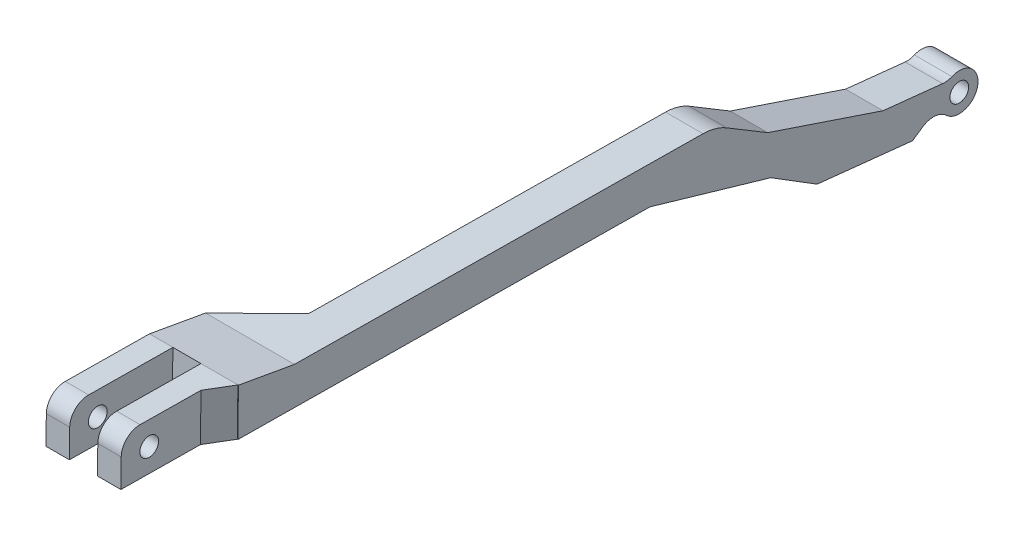
ISO-10303-21;
HEADER;
FILE_DESCRIPTION(('STEP AP214'),'2;1');
FILE_NAME('part.step','',(''),(''),'','','');
FILE_SCHEMA(('AUTOMOTIVE_DESIGN { 1 0 10303 214 1 1 1 1 }'));
ENDSEC;
DATA;
#1=APPLICATION_CONTEXT('core data for automotive mechanical design processes');
#2=APPLICATION_PROTOCOL_DEFINITION('international standard','automotive_design',2000,#1);
#3=PRODUCT_CONTEXT('',#1,'mechanical');
#4=PRODUCT('Part','Part','',(#3));
#5=PRODUCT_RELATED_PRODUCT_CATEGORY('part','',(#4));
#6=PRODUCT_DEFINITION_FORMATION('','',#4);
#7=PRODUCT_DEFINITION_CONTEXT('part definition',#1,'design');
#8=PRODUCT_DEFINITION('design','',#6,#7);
#9=PRODUCT_DEFINITION_SHAPE('','',#8);
#10=(LENGTH_UNIT() NAMED_UNIT(*) SI_UNIT(.MILLI.,.METRE.));
#11=(NAMED_UNIT(*) PLANE_ANGLE_UNIT() SI_UNIT($,.RADIAN.));
#12=(NAMED_UNIT(*) SI_UNIT($,.STERADIAN.) SOLID_ANGLE_UNIT());
#13=UNCERTAINTY_MEASURE_WITH_UNIT(LENGTH_MEASURE(1.E-05),#10,'distance_accuracy_value','');
#14=(GEOMETRIC_REPRESENTATION_CONTEXT(3) GLOBAL_UNCERTAINTY_ASSIGNED_CONTEXT((#13)) GLOBAL_UNIT_ASSIGNED_CONTEXT((#10,
#11,#12)) REPRESENTATION_CONTEXT('',''));
#15=CARTESIAN_POINT('',(0.,0.,0.));
#16=DIRECTION('',(0.,0.,1.));
#17=DIRECTION('',(1.,0.,0.));
#18=AXIS2_PLACEMENT_3D('',#15,#16,#17);
#19=CARTESIAN_POINT('',(-2.,8.74244408116195,35.8710446183788));
#20=DIRECTION('',(0.,0.960167582099717,-0.279424791822029));
#21=DIRECTION('',(1.,0.,0.));
#22=AXIS2_PLACEMENT_3D('',#19,#20,#21);
#23=PLANE('',#22);
#24=DIRECTION('',(1.,0.,0.));
#25=VECTOR('',#24,1.);
#26=CARTESIAN_POINT('',(-2.,8.74244408116195,35.8710446183788));
#27=LINE('',#26,#25);
#28=CARTESIAN_POINT('',(-2.,8.74244408116195,35.8710446183788));
#29=VERTEX_POINT('',#28);
#30=CARTESIAN_POINT('',(2.,8.74244408116195,35.8710446183788));
#31=VERTEX_POINT('',#30);
#32=EDGE_CURVE('E432',#29,#31,#27,.T.);
#33=ORIENTED_EDGE('',*,*,#32,.F.);
#34=DIRECTION('',(0.,0.279424791822029,0.960167582099717));
#35=VECTOR('',#34,1.);
#36=CARTESIAN_POINT('',(-2.,-1.56415886793033,0.455196336760537));
#37=LINE('',#36,#35);
#38=CARTESIAN_POINT('',(-2.,4.98714456433867,22.9669753923918));
#39=VERTEX_POINT('',#38);
#40=EDGE_CURVE('E51',#29,#39,#37,.F.);
#41=ORIENTED_EDGE('',*,*,#40,.T.);
#42=DIRECTION('',(-1.,0.,0.));
#43=VECTOR('',#42,1.);
#44=CARTESIAN_POINT('',(-2.,4.98714456433864,22.9669753923918));
#45=LINE('',#44,#43);
#46=CARTESIAN_POINT('',(2.,4.98714456433867,22.9669753923918));
#47=VERTEX_POINT('',#46);
#48=EDGE_CURVE('E435',#47,#39,#45,.T.);
#49=ORIENTED_EDGE('',*,*,#48,.F.);
#50=DIRECTION('',(0.,-0.279424791822029,-0.960167582099717));
#51=VECTOR('',#50,1.);
#52=CARTESIAN_POINT('',(2.,8.74244408116195,35.8710446183788));
#53=LINE('',#52,#51);
#54=EDGE_CURVE('E12',#47,#31,#53,.F.);
#55=ORIENTED_EDGE('',*,*,#54,.T.);
#56=EDGE_LOOP('',(#33,#41,#49,#55));
#57=FACE_BOUND('',#56,.T.);
#58=ADVANCED_FACE('F43',(#57),#23,.F.);
#59=CARTESIAN_POINT('',(-2.,5.18956645271218,10.9745077659779));
#60=DIRECTION('',(0.,-0.948132723625125,0.317874721220801));
#61=DIRECTION('',(1.,0.,0.));
#62=AXIS2_PLACEMENT_3D('',#59,#60,#61);
#63=PLANE('',#62);
#64=DIRECTION('',(1.,0.,0.));
#65=VECTOR('',#64,1.);
#66=CARTESIAN_POINT('',(-2.,5.18956645271218,10.974507765978));
#67=LINE('',#66,#65);
#68=CARTESIAN_POINT('',(-2.,5.18956645271218,10.9745077659779));
#69=VERTEX_POINT('',#68);
#70=CARTESIAN_POINT('',(2.,5.18956645271218,10.9745077659779));
#71=VERTEX_POINT('',#70);
#72=EDGE_CURVE('E422',#69,#71,#67,.T.);
#73=ORIENTED_EDGE('',*,*,#72,.F.);
#74=DIRECTION('',(0.,-0.317874721220801,-0.948132723625125));
#75=VECTOR('',#74,1.);
#76=CARTESIAN_POINT('',(-2.,1.35761150550606,-0.455158194718652));
#77=LINE('',#76,#75);
#78=CARTESIAN_POINT('',(-2.,9.31760736921488,23.2873166057881));
#79=VERTEX_POINT('',#78);
#80=EDGE_CURVE('E428',#69,#79,#77,.F.);
#81=ORIENTED_EDGE('',*,*,#80,.T.);
#82=DIRECTION('',(-1.,0.,0.));
#83=VECTOR('',#82,1.);
#84=CARTESIAN_POINT('',(-2.,9.31760736921488,23.2873166057881));
#85=LINE('',#84,#83);
#86=CARTESIAN_POINT('',(2.,9.31760736921488,23.2873166057881));
#87=VERTEX_POINT('',#86);
#88=EDGE_CURVE('E425',#87,#79,#85,.T.);
#89=ORIENTED_EDGE('',*,*,#88,.F.);
#90=DIRECTION('',(0.,0.317874721220801,0.948132723625125));
#91=VECTOR('',#90,1.);
#92=CARTESIAN_POINT('',(2.,5.18956645271218,10.9745077659779));
#93=LINE('',#92,#91);
#94=EDGE_CURVE('E430',#87,#71,#93,.F.);
#95=ORIENTED_EDGE('',*,*,#94,.T.);
#96=EDGE_LOOP('',(#73,#81,#89,#95));
#97=FACE_BOUND('',#96,.T.);
#98=ADVANCED_FACE('F475',(#97),#63,.F.);
#99=CARTESIAN_POINT('',(-2.,0.,0.));
#100=DIRECTION('',(1.,0.,0.));
#101=DIRECTION('',(0.,0.,-1.));
#102=AXIS2_PLACEMENT_3D('',#99,#100,#101);
#103=PLANE('',#102);
#104=ORIENTED_EDGE('',*,*,#40,.F.);
#105=DIRECTION('',(0.,0.0110604080364561,0.99993883181626));
#106=VECTOR('',#105,1.);
#107=CARTESIAN_POINT('',(-2.,8.34465047322567,-0.0923008850329777));
#108=LINE('',#107,#106);
#109=CARTESIAN_POINT('',(-2.,9.10216799989494,68.3926219316773));
#110=VERTEX_POINT('',#109);
#111=EDGE_CURVE('E337',#29,#110,#108,.T.);
#112=ORIENTED_EDGE('',*,*,#111,.T.);
#113=DIRECTION('',(0.,0.99993883181626,-0.011060408036466));
#114=VECTOR('',#113,1.);
#115=CARTESIAN_POINT('',(-2.,13.1019233271599,68.3483802995314));
#116=LINE('',#115,#114);
#117=CARTESIAN_POINT('',(-2.,13.10192332716,68.3483802995314));
#118=VERTEX_POINT('',#117);
#119=EDGE_CURVE('E362',#110,#118,#116,.T.);
#120=ORIENTED_EDGE('',*,*,#119,.T.);
#121=DIRECTION('',(0.,-0.0110604080364563,-0.99993883181626));
#122=VECTOR('',#121,1.);
#123=CARTESIAN_POINT('',(-2.,12.3444058004907,-0.136542517178804));
#124=LINE('',#123,#122);
#125=CARTESIAN_POINT('',(-2.,12.6800628135767,30.2092169204379));
#126=VERTEX_POINT('',#125);
#127=EDGE_CURVE('E333',#118,#126,#124,.T.);
#128=ORIENTED_EDGE('',*,*,#127,.T.);
#129=CARTESIAN_POINT('',(-2.,7.68036865449542,30.2645189606202));
#130=DIRECTION('',(1.,0.,0.));
#131=DIRECTION('',(0.,0.,-1.));
#132=AXIS2_PLACEMENT_3D('',#129,#130,#131);
#133=CIRCLE('',#132,5.);
#134=CARTESIAN_POINT('',(-2.,11.9646562062617,27.6867524518415));
#135=VERTEX_POINT('',#134);
#136=EDGE_CURVE('E420',#126,#135,#133,.F.);
#137=ORIENTED_EDGE('',*,*,#136,.T.);
#138=DIRECTION('',(0.,-0.515553301755732,-0.856857510353246));
#139=VECTOR('',#138,1.);
#140=CARTESIAN_POINT('',(-2.,-3.44627329115737,2.07355079758396));
#141=LINE('',#140,#139);
#142=EDGE_CURVE('E330',#135,#79,#141,.T.);
#143=ORIENTED_EDGE('',*,*,#142,.T.);
#144=ORIENTED_EDGE('',*,*,#80,.F.);
#145=DIRECTION('',(0.,0.105126340428727,0.994458874236669));
#146=VECTOR('',#145,1.);
#147=CARTESIAN_POINT('',(-2.,3.98489672467589,-0.421251818958479));
#148=LINE('',#147,#146);
#149=CARTESIAN_POINT('',(-2.,4.51699740557244,4.61223685711407));
#150=VERTEX_POINT('',#149);
#151=EDGE_CURVE('E354',#150,#69,#148,.T.);
#152=ORIENTED_EDGE('',*,*,#151,.F.);
#153=CARTESIAN_POINT('',(-2.,6.50591515404578,4.40198417625661));
#154=DIRECTION('',(1.,0.,0.));
#155=DIRECTION('',(0.,0.,-1.));
#156=AXIS2_PLACEMENT_3D('',#153,#154,#155);
#157=CIRCLE('',#156,2.);
#158=CARTESIAN_POINT('',(-2.,4.66717113939598,3.61520565050141));
#159=VERTEX_POINT('',#158);
#160=EDGE_CURVE('E352',#150,#159,#157,.T.);
#161=ORIENTED_EDGE('',*,*,#160,.T.);
#162=CARTESIAN_POINT('',(-2.,2.82842712474617,2.82842712474621));
#163=DIRECTION('',(1.,0.,0.));
#164=DIRECTION('',(0.,0.,-1.));
#165=AXIS2_PLACEMENT_3D('',#162,#163,#164);
#166=CIRCLE('',#165,2.);
#167=CARTESIAN_POINT('',(-2.,1.38051311307682,4.20811731272739));
#168=VERTEX_POINT('',#167);
#169=EDGE_CURVE('E349',#168,#159,#166,.T.);
#170=ORIENTED_EDGE('',*,*,#169,.F.);
#171=CARTESIAN_POINT('',(-2.,-0.0674008985925268,5.58780750070858));
#172=DIRECTION('',(1.,0.,0.));
#173=DIRECTION('',(0.,0.,-1.));
#174=AXIS2_PLACEMENT_3D('',#171,#172,#173);
#175=CIRCLE('',#174,2.);
#176=CARTESIAN_POINT('',(-2.,1.59134630860474,6.70519628829116));
#177=VERTEX_POINT('',#176);
#178=EDGE_CURVE('E347',#168,#177,#175,.T.);
#179=ORIENTED_EDGE('',*,*,#178,.T.);
#180=DIRECTION('',(0.,0.55869439379129,-0.829373603598633));
#181=VECTOR('',#180,1.);
#182=CARTESIAN_POINT('',(-2.,4.20158693514596,2.83033250094704));
#183=LINE('',#182,#181);
#184=CARTESIAN_POINT('',(-2.,0.834699643533607,7.8284271247462));
#185=VERTEX_POINT('',#184);
#186=EDGE_CURVE('E344',#185,#177,#183,.T.);
#187=ORIENTED_EDGE('',*,*,#186,.F.);
#188=DIRECTION('',(0.,0.105126340428727,0.994458874236669));
#189=VECTOR('',#188,1.);
#190=CARTESIAN_POINT('',(-2.,0.00706122772921731,-0.000746457243570038));
#191=LINE('',#190,#189);
#192=CARTESIAN_POINT('',(-2.,1.9109094130525,18.0089998667781));
#193=VERTEX_POINT('',#192);
#194=EDGE_CURVE('E341',#185,#193,#191,.T.);
#195=ORIENTED_EDGE('',*,*,#194,.T.);
#196=DIRECTION('',(0.,-0.527223177075936,-0.849726851143328));
#197=VECTOR('',#196,1.);
#198=CARTESIAN_POINT('',(-2.,-6.6882094665678,4.14977947227237));
#199=LINE('',#198,#197);
#200=EDGE_CURVE('E339',#39,#193,#199,.T.);
#201=ORIENTED_EDGE('',*,*,#200,.F.);
#202=EDGE_LOOP('',(#104,#112,#120,#128,#137,#143,#144,#152,#161,#170,#179,#187,#195,#201));
#203=FACE_BOUND('',#202,.T.);
#204=CARTESIAN_POINT('',(-2.,2.82842712474617,2.82842712474621));
#205=DIRECTION('',(1.,0.,0.));
#206=DIRECTION('',(0.,0.,-1.));
#207=AXIS2_PLACEMENT_3D('',#204,#205,#206);
#208=CIRCLE('',#207,1.);
#209=CARTESIAN_POINT('',(-2.,2.82842712474617,1.82842712474621));
#210=VERTEX_POINT('',#209);
#211=EDGE_CURVE('E357',#210,#210,#208,.T.);
#212=ORIENTED_EDGE('',*,*,#211,.T.);
#213=EDGE_LOOP('',(#212));
#214=FACE_BOUND('',#213,.T.);
#215=ADVANCED_FACE('F441',(#203,#214),#103,.F.);
#216=CARTESIAN_POINT('',(-2.,11.8176930361465,87.8637781320032));
#217=DIRECTION('',(1.,0.,0.));
#218=DIRECTION('',(0.,0.,-1.));
#219=AXIS2_PLACEMENT_3D('',#216,#217,#218);
#220=CIRCLE('',#219,0.999999999999998);
#221=CARTESIAN_POINT('',(-2.,11.8176930361465,86.8637781320032));
#222=VERTEX_POINT('',#221);
#223=EDGE_CURVE('E271',#222,#222,#220,.T.);
#224=ORIENTED_EDGE('',*,*,#223,.T.);
#225=EDGE_LOOP('',(#224));
#226=FACE_BOUND('',#225,.T.);
#227=DIRECTION('',(0.,-0.99993883181626,0.0110604080364562));
#228=VECTOR('',#227,1.);
#229=CARTESIAN_POINT('',(-2.,1.00637670748955,90.9835465325761));
#230=LINE('',#229,#228);
#231=CARTESIAN_POINT('',(-2.,12.350843676164,90.8580644234337));
#232=VERTEX_POINT('',#231);
#233=CARTESIAN_POINT('',(-2.,9.35102718071522,90.8912456475431));
#234=VERTEX_POINT('',#233);
#235=EDGE_CURVE('E275',#232,#234,#230,.T.);
#236=ORIENTED_EDGE('',*,*,#235,.F.);
#237=CARTESIAN_POINT('',(-2.,12.3287228600911,88.8581867598012));
#238=DIRECTION('',(1.,0.,0.));
#239=DIRECTION('',(0.,0.,-1.));
#240=AXIS2_PLACEMENT_3D('',#237,#238,#239);
#241=CIRCLE('',#240,2.);
#242=CARTESIAN_POINT('',(-2.,14.3286005237236,88.8360659437283));
#243=VERTEX_POINT('',#242);
#244=EDGE_CURVE('E407',#232,#243,#241,.F.);
#245=ORIENTED_EDGE('',*,*,#244,.T.);
#246=DIRECTION('',(0.,0.011060408036456,0.99993883181626));
#247=VECTOR('',#246,1.);
#248=CARTESIAN_POINT('',(-2.,13.344344632307,-0.147602925215257));
#249=LINE('',#248,#247);
#250=CARTESIAN_POINT('',(-2.,14.2290568513955,79.836616457382));
#251=VERTEX_POINT('',#250);
#252=EDGE_CURVE('E282',#251,#243,#249,.T.);
#253=ORIENTED_EDGE('',*,*,#252,.F.);
#254=DIRECTION('',(0.,0.99993883181626,-0.0110604080364562));
#255=VECTOR('',#254,1.);
#256=CARTESIAN_POINT('',(-2.,0.884712219088531,79.9842193825972));
#257=LINE('',#256,#255);
#258=CARTESIAN_POINT('',(-2.,9.22936269231419,79.8919184975642));
#259=VERTEX_POINT('',#258);
#260=EDGE_CURVE('E259',#259,#251,#257,.T.);
#261=ORIENTED_EDGE('',*,*,#260,.F.);
#262=EDGE_CURVE('E336',#259,#234,#108,.T.);
#263=ORIENTED_EDGE('',*,*,#262,.T.);
#264=EDGE_LOOP('',(#236,#245,#253,#261,#263));
#265=FACE_BOUND('',#264,.T.);
#266=ADVANCED_FACE('F506',(#226,#265),#103,.F.);
#267=CARTESIAN_POINT('',(-2.,-3.44627329115737,2.07355079758396));
#268=DIRECTION('',(0.,-0.856857510353246,0.515553301755732));
#269=DIRECTION('',(0.,-0.515553301755732,-0.856857510353246));
#270=AXIS2_PLACEMENT_3D('',#267,#268,#269);
#271=PLANE('',#270);
#272=DIRECTION('',(0.,-0.515553301755732,-0.856857510353246));
#273=VECTOR('',#272,1.);
#274=CARTESIAN_POINT('',(2.,-3.44627329115737,2.07355079758396));
#275=LINE('',#274,#273);
#276=CARTESIAN_POINT('',(2.,11.9646562062617,27.6867524518415));
#277=VERTEX_POINT('',#276);
#278=EDGE_CURVE('E293',#277,#87,#275,.T.);
#279=ORIENTED_EDGE('',*,*,#278,.T.);
#280=ORIENTED_EDGE('',*,*,#88,.T.);
#281=ORIENTED_EDGE('',*,*,#142,.F.);
#282=DIRECTION('',(1.,0.,0.));
#283=VECTOR('',#282,1.);
#284=CARTESIAN_POINT('',(-2.,11.9646562062617,27.6867524518415));
#285=LINE('',#284,#283);
#286=EDGE_CURVE('E413',#135,#277,#285,.T.);
#287=ORIENTED_EDGE('',*,*,#286,.T.);
#288=EDGE_LOOP('',(#279,#280,#281,#287));
#289=FACE_BOUND('',#288,.T.);
#290=ADVANCED_FACE('F478',(#289),#271,.F.);
#291=CARTESIAN_POINT('',(-2.,3.98489672467589,-0.421251818958479));
#292=DIRECTION('',(0.,0.994458874236669,-0.105126340428727));
#293=DIRECTION('',(0.,0.105126340428727,0.994458874236669));
#294=AXIS2_PLACEMENT_3D('',#291,#292,#293);
#295=PLANE('',#294);
#296=ORIENTED_EDGE('',*,*,#151,.T.);
#297=ORIENTED_EDGE('',*,*,#72,.T.);
#298=DIRECTION('',(0.,0.105126340428727,0.994458874236669));
#299=VECTOR('',#298,1.);
#300=CARTESIAN_POINT('',(2.,3.98489672467589,-0.421251818958479));
#301=LINE('',#300,#299);
#302=CARTESIAN_POINT('',(2.,4.51699740557244,4.61223685711407));
#303=VERTEX_POINT('',#302);
#304=EDGE_CURVE('E324',#303,#71,#301,.T.);
#305=ORIENTED_EDGE('',*,*,#304,.F.);
#306=DIRECTION('',(1.,0.,0.));
#307=VECTOR('',#306,1.);
#308=CARTESIAN_POINT('',(-2.,4.51699740557244,4.61223685711407));
#309=LINE('',#308,#307);
#310=EDGE_CURVE('E360',#150,#303,#309,.T.);
#311=ORIENTED_EDGE('',*,*,#310,.F.);
#312=EDGE_LOOP('',(#296,#297,#305,#311));
#313=FACE_BOUND('',#312,.T.);
#314=ADVANCED_FACE('F470',(#313),#295,.T.);
#315=CARTESIAN_POINT('',(-2.,6.50591515404578,4.40198417625661));
#316=DIRECTION('',(1.,0.,0.));
#317=DIRECTION('',(0.,0.,-1.));
#318=AXIS2_PLACEMENT_3D('',#315,#316,#317);
#319=CYLINDRICAL_SURFACE('',#318,2.);
#320=ORIENTED_EDGE('',*,*,#310,.T.);
#321=CARTESIAN_POINT('',(2.,6.50591515404578,4.40198417625661));
#322=DIRECTION('',(1.,0.,0.));
#323=DIRECTION('',(0.,0.,-1.));
#324=AXIS2_PLACEMENT_3D('',#321,#322,#323);
#325=CIRCLE('',#324,2.);
#326=CARTESIAN_POINT('',(2.,4.66717113939598,3.61520565050141));
#327=VERTEX_POINT('',#326);
#328=EDGE_CURVE('E321',#303,#327,#325,.T.);
#329=ORIENTED_EDGE('',*,*,#328,.T.);
#330=DIRECTION('',(1.,0.,0.));
#331=VECTOR('',#330,1.);
#332=CARTESIAN_POINT('',(-2.,4.66717113939598,3.61520565050141));
#333=LINE('',#332,#331);
#334=EDGE_CURVE('E363',#159,#327,#333,.T.);
#335=ORIENTED_EDGE('',*,*,#334,.F.);
#336=ORIENTED_EDGE('',*,*,#160,.F.);
#337=EDGE_LOOP('',(#320,#329,#335,#336));
#338=FACE_BOUND('',#337,.T.);
#339=ADVANCED_FACE('F465',(#338),#319,.F.);
#340=CARTESIAN_POINT('',(-2.,2.82842712474617,2.82842712474621));
#341=DIRECTION('',(1.,0.,0.));
#342=DIRECTION('',(0.,0.,-1.));
#343=AXIS2_PLACEMENT_3D('',#340,#341,#342);
#344=CYLINDRICAL_SURFACE('',#343,2.);
#345=ORIENTED_EDGE('',*,*,#334,.T.);
#346=CARTESIAN_POINT('',(2.,2.82842712474617,2.82842712474621));
#347=DIRECTION('',(1.,0.,0.));
#348=DIRECTION('',(0.,0.,-1.));
#349=AXIS2_PLACEMENT_3D('',#346,#347,#348);
#350=CIRCLE('',#349,2.);
#351=CARTESIAN_POINT('',(2.,1.38051311307682,4.20811731272739));
#352=VERTEX_POINT('',#351);
#353=EDGE_CURVE('E318',#352,#327,#350,.T.);
#354=ORIENTED_EDGE('',*,*,#353,.F.);
#355=DIRECTION('',(1.,0.,0.));
#356=VECTOR('',#355,1.);
#357=CARTESIAN_POINT('',(-2.,1.38051311307682,4.20811731272739));
#358=LINE('',#357,#356);
#359=EDGE_CURVE('E365',#168,#352,#358,.T.);
#360=ORIENTED_EDGE('',*,*,#359,.F.);
#361=ORIENTED_EDGE('',*,*,#169,.T.);
#362=EDGE_LOOP('',(#345,#354,#360,#361));
#363=FACE_BOUND('',#362,.T.);
#364=ADVANCED_FACE('F461',(#363),#344,.T.);
#365=CARTESIAN_POINT('',(-2.,-0.0674008985925268,5.58780750070858));
#366=DIRECTION('',(1.,0.,0.));
#367=DIRECTION('',(0.,0.,-1.));
#368=AXIS2_PLACEMENT_3D('',#365,#366,#367);
#369=CYLINDRICAL_SURFACE('',#368,2.);
#370=ORIENTED_EDGE('',*,*,#359,.T.);
#371=CARTESIAN_POINT('',(2.,-0.0674008985925268,5.58780750070858));
#372=DIRECTION('',(1.,0.,0.));
#373=DIRECTION('',(0.,0.,-1.));
#374=AXIS2_PLACEMENT_3D('',#371,#372,#373);
#375=CIRCLE('',#374,2.);
#376=CARTESIAN_POINT('',(2.,1.59134630860474,6.70519628829116));
#377=VERTEX_POINT('',#376);
#378=EDGE_CURVE('E315',#352,#377,#375,.T.);
#379=ORIENTED_EDGE('',*,*,#378,.T.);
#380=DIRECTION('',(1.,0.,0.));
#381=VECTOR('',#380,1.);
#382=CARTESIAN_POINT('',(-2.,1.59134630860474,6.70519628829116));
#383=LINE('',#382,#381);
#384=EDGE_CURVE('E367',#177,#377,#383,.T.);
#385=ORIENTED_EDGE('',*,*,#384,.F.);
#386=ORIENTED_EDGE('',*,*,#178,.F.);
#387=EDGE_LOOP('',(#370,#379,#385,#386));
#388=FACE_BOUND('',#387,.T.);
#389=ADVANCED_FACE('F456',(#388),#369,.F.);
#390=CARTESIAN_POINT('',(-2.,4.20158693514596,2.83033250094704));
#391=DIRECTION('',(0.,-0.829373603598633,-0.55869439379129));
#392=DIRECTION('',(0.,0.55869439379129,-0.829373603598633));
#393=AXIS2_PLACEMENT_3D('',#390,#391,#392);
#394=PLANE('',#393);
#395=ORIENTED_EDGE('',*,*,#384,.T.);
#396=DIRECTION('',(0.,0.55869439379129,-0.829373603598633));
#397=VECTOR('',#396,1.);
#398=CARTESIAN_POINT('',(2.,4.20158693514596,2.83033250094704));
#399=LINE('',#398,#397);
#400=CARTESIAN_POINT('',(2.,0.834699643533607,7.8284271247462));
#401=VERTEX_POINT('',#400);
#402=EDGE_CURVE('E312',#401,#377,#399,.T.);
#403=ORIENTED_EDGE('',*,*,#402,.F.);
#404=DIRECTION('',(1.,0.,0.));
#405=VECTOR('',#404,1.);
#406=CARTESIAN_POINT('',(-2.,0.834699643533607,7.8284271247462));
#407=LINE('',#406,#405);
#408=EDGE_CURVE('E369',#185,#401,#407,.T.);
#409=ORIENTED_EDGE('',*,*,#408,.F.);
#410=ORIENTED_EDGE('',*,*,#186,.T.);
#411=EDGE_LOOP('',(#395,#403,#409,#410));
#412=FACE_BOUND('',#411,.T.);
#413=ADVANCED_FACE('F552',(#412),#394,.T.);
#414=CARTESIAN_POINT('',(-2.,0.00706122772921731,-0.000746457243570038));
#415=DIRECTION('',(0.,0.994458874236669,-0.105126340428727));
#416=DIRECTION('',(0.,0.105126340428727,0.994458874236669));
#417=AXIS2_PLACEMENT_3D('',#414,#415,#416);
#418=PLANE('',#417);
#419=ORIENTED_EDGE('',*,*,#408,.T.);
#420=DIRECTION('',(0.,0.105126340428727,0.994458874236669));
#421=VECTOR('',#420,1.);
#422=CARTESIAN_POINT('',(2.,0.00706122772921731,-0.000746457243570038));
#423=LINE('',#422,#421);
#424=CARTESIAN_POINT('',(2.,1.9109094130525,18.0089998667781));
#425=VERTEX_POINT('',#424);
#426=EDGE_CURVE('E309',#401,#425,#423,.T.);
#427=ORIENTED_EDGE('',*,*,#426,.T.);
#428=DIRECTION('',(1.,0.,0.));
#429=VECTOR('',#428,1.);
#430=CARTESIAN_POINT('',(-2.,1.9109094130525,18.0089998667781));
#431=LINE('',#430,#429);
#432=EDGE_CURVE('E371',#193,#425,#431,.T.);
#433=ORIENTED_EDGE('',*,*,#432,.F.);
#434=ORIENTED_EDGE('',*,*,#194,.F.);
#435=EDGE_LOOP('',(#419,#427,#433,#434));
#436=FACE_BOUND('',#435,.T.);
#437=ADVANCED_FACE('F447',(#436),#418,.F.);
#438=CARTESIAN_POINT('',(-2.,-6.6882094665678,4.14977947227237));
#439=DIRECTION('',(0.,-0.849726851143329,0.527223177075936));
#440=DIRECTION('',(0.,-0.527223177075936,-0.849726851143329));
#441=AXIS2_PLACEMENT_3D('',#438,#439,#440);
#442=PLANE('',#441);
#443=DIRECTION('',(0.,-0.527223177075936,-0.849726851143328));
#444=VECTOR('',#443,1.);
#445=CARTESIAN_POINT('',(2.,-6.6882094665678,4.14977947227237));
#446=LINE('',#445,#444);
#447=EDGE_CURVE('E307',#47,#425,#446,.T.);
#448=ORIENTED_EDGE('',*,*,#447,.F.);
#449=ORIENTED_EDGE('',*,*,#48,.T.);
#450=ORIENTED_EDGE('',*,*,#200,.T.);
#451=ORIENTED_EDGE('',*,*,#432,.T.);
#452=EDGE_LOOP('',(#448,#449,#450,#451));
#453=FACE_BOUND('',#452,.T.);
#454=ADVANCED_FACE('F439',(#453),#442,.T.);
#455=CARTESIAN_POINT('',(-2.,8.34465047322567,-0.0923008850329777));
#456=DIRECTION('',(0.,0.99993883181626,-0.0110604080364561));
#457=DIRECTION('',(0.,0.0110604080364561,0.99993883181626));
#458=AXIS2_PLACEMENT_3D('',#455,#456,#457);
#459=PLANE('',#458);
#460=ORIENTED_EDGE('',*,*,#111,.F.);
#461=ORIENTED_EDGE('',*,*,#32,.T.);
#462=DIRECTION('',(0.,0.0110604080364561,0.99993883181626));
#463=VECTOR('',#462,1.);
#464=CARTESIAN_POINT('',(2.,8.34465047322567,-0.0923008850329777));
#465=LINE('',#464,#463);
#466=CARTESIAN_POINT('',(2.,9.22936269231419,79.8919184975643));
#467=VERTEX_POINT('',#466);
#468=EDGE_CURVE('E305',#31,#467,#465,.T.);
#469=ORIENTED_EDGE('',*,*,#468,.T.);
#470=DIRECTION('',(1.,0.,0.));
#471=VECTOR('',#470,1.);
#472=CARTESIAN_POINT('',(-2.,9.22936269231419,79.8919184975643));
#473=LINE('',#472,#471);
#474=CARTESIAN_POINT('',(1.94337567297408,9.22936269231419,79.8919184975643));
#475=VERTEX_POINT('',#474);
#476=EDGE_CURVE('E374',#475,#467,#473,.T.);
#477=ORIENTED_EDGE('',*,*,#476,.F.);
#478=DIRECTION('',(-0.500000000000003,0.00957859433579255,0.865972430583415));
#479=VECTOR('',#478,1.);
#480=CARTESIAN_POINT('',(35.5938333379884,8.58471452594032,21.611181268731));
#481=LINE('',#480,#479);
#482=CARTESIAN_POINT('',(0.5,9.25701371240533,82.3917655771049));
#483=VERTEX_POINT('',#482);
#484=EDGE_CURVE('E392',#475,#483,#481,.T.);
#485=ORIENTED_EDGE('',*,*,#484,.T.);
#486=DIRECTION('',(0.,-0.0110604080364565,-0.99993883181626));
#487=VECTOR('',#486,1.);
#488=CARTESIAN_POINT('',(0.5,8.34465047322564,-0.0923008850329805));
#489=LINE('',#488,#487);
#490=CARTESIAN_POINT('',(0.5,9.35102718071522,90.8912456475431));
#491=VERTEX_POINT('',#490);
#492=EDGE_CURVE('E278',#491,#483,#489,.T.);
#493=ORIENTED_EDGE('',*,*,#492,.F.);
#494=DIRECTION('',(-1.,0.,0.));
#495=VECTOR('',#494,1.);
#496=CARTESIAN_POINT('',(0.5,9.35102718071522,90.8912456475431));
#497=LINE('',#496,#495);
#498=EDGE_CURVE('E287',#491,#234,#497,.T.);
#499=ORIENTED_EDGE('',*,*,#498,.T.);
#500=ORIENTED_EDGE('',*,*,#262,.F.);
#501=DIRECTION('',(1.,0.,0.));
#502=VECTOR('',#501,1.);
#503=CARTESIAN_POINT('',(-5.,9.22936269231419,79.8919184975643));
#504=LINE('',#503,#502);
#505=CARTESIAN_POINT('',(-5.,9.22936269231419,79.8919184975643));
#506=VERTEX_POINT('',#505);
#507=EDGE_CURVE('E268',#506,#259,#504,.T.);
#508=ORIENTED_EDGE('',*,*,#507,.F.);
#509=DIRECTION('',(0.,0.0110604080364565,0.99993883181626));
#510=VECTOR('',#509,1.);
#511=CARTESIAN_POINT('',(-5.,8.34465047322564,-0.0923008850329805));
#512=LINE('',#511,#510);
#513=CARTESIAN_POINT('',(-5.,9.35102718071521,90.8912456475431));
#514=VERTEX_POINT('',#513);
#515=EDGE_CURVE('E246',#506,#514,#512,.T.);
#516=ORIENTED_EDGE('',*,*,#515,.T.);
#517=DIRECTION('',(1.,0.,0.));
#518=VECTOR('',#517,1.);
#519=CARTESIAN_POINT('',(-7.5,9.35102718071521,90.8912456475431));
#520=LINE('',#519,#518);
#521=CARTESIAN_POINT('',(-7.5,9.35102718071521,90.8912456475431));
#522=VERTEX_POINT('',#521);
#523=EDGE_CURVE('E237',#522,#514,#520,.T.);
#524=ORIENTED_EDGE('',*,*,#523,.F.);
#525=DIRECTION('',(0.,0.0110604080364565,0.99993883181626));
#526=VECTOR('',#525,1.);
#527=CARTESIAN_POINT('',(-7.5,8.34465047322564,-0.0923008850329805));
#528=LINE('',#527,#526);
#529=CARTESIAN_POINT('',(-7.5,9.16300024409545,73.8922855066667));
#530=VERTEX_POINT('',#529);
#531=EDGE_CURVE('E238',#530,#522,#528,.T.);
#532=ORIENTED_EDGE('',*,*,#531,.F.);
#533=DIRECTION('',(-0.70710678118655,0.00782088952526829,0.70706352874903));
#534=VECTOR('',#533,1.);
#535=CARTESIAN_POINT('',(32.2445560856539,8.72340923656031,34.1501605233224));
#536=LINE('',#535,#534);
#537=EDGE_CURVE('E382',#530,#110,#536,.F.);
#538=ORIENTED_EDGE('',*,*,#537,.T.);
#539=EDGE_LOOP('',(#460,#461,#469,#477,#485,#493,#499,#500,#508,#516,#524,#532,#538));
#540=FACE_BOUND('',#539,.T.);
#541=ADVANCED_FACE('F497',(#540),#459,.F.);
#542=CARTESIAN_POINT('',(-2.,0.884712219088531,79.9842193825972));
#543=DIRECTION('',(0.,-0.0110604080364562,-0.99993883181626));
#544=DIRECTION('',(0.,0.99993883181626,-0.0110604080364562));
#545=AXIS2_PLACEMENT_3D('',#542,#543,#544);
#546=PLANE('',#545);
#547=DIRECTION('',(1.,0.,0.));
#548=VECTOR('',#547,1.);
#549=CARTESIAN_POINT('',(-2.,14.2290568513955,79.836616457382));
#550=LINE('',#549,#548);
#551=CARTESIAN_POINT('',(1.94337567297408,14.2290568513955,79.836616457382));
#552=VERTEX_POINT('',#551);
#553=CARTESIAN_POINT('',(2.,14.2290568513955,79.836616457382));
#554=VERTEX_POINT('',#553);
#555=EDGE_CURVE('E379',#552,#554,#550,.T.);
#556=ORIENTED_EDGE('',*,*,#555,.F.);
#557=DIRECTION('',(0.,-0.99993883181626,0.0110604080364562));
#558=VECTOR('',#557,1.);
#559=CARTESIAN_POINT('',(1.94337567297408,0.884712219088531,79.9842193825972));
#560=LINE('',#559,#558);
#561=EDGE_CURVE('E387',#552,#475,#560,.T.);
#562=ORIENTED_EDGE('',*,*,#561,.T.);
#563=ORIENTED_EDGE('',*,*,#476,.T.);
#564=DIRECTION('',(0.,0.99993883181626,-0.0110604080364562));
#565=VECTOR('',#564,1.);
#566=CARTESIAN_POINT('',(2.,0.884712219088531,79.9842193825972));
#567=LINE('',#566,#565);
#568=EDGE_CURVE('E302',#467,#554,#567,.T.);
#569=ORIENTED_EDGE('',*,*,#568,.T.);
#570=EDGE_LOOP('',(#556,#562,#563,#569));
#571=FACE_BOUND('',#570,.T.);
#572=ADVANCED_FACE('F492',(#571),#546,.F.);
#573=CARTESIAN_POINT('',(-2.,0.0132482468990224,-0.00235892985034143));
#574=DIRECTION('',(0.,0.984515268026993,-0.17529885060016));
#575=DIRECTION('',(0.,0.17529885060016,0.984515268026994));
#576=AXIS2_PLACEMENT_3D('',#573,#574,#575);
#577=PLANE('',#576);
#578=DIRECTION('',(0.,0.17529885060016,0.984515268026994));
#579=VECTOR('',#578,1.);
#580=CARTESIAN_POINT('',(2.,0.0132482468990224,-0.00235892985034143));
#581=LINE('',#580,#579);
#582=CARTESIAN_POINT('',(2.,13.1627555713605,73.8480438745208));
#583=VERTEX_POINT('',#582);
#584=EDGE_CURVE('E299',#583,#554,#581,.T.);
#585=ORIENTED_EDGE('',*,*,#584,.F.);
#586=DIRECTION('',(1.,0.,0.));
#587=VECTOR('',#586,1.);
#588=CARTESIAN_POINT('',(-2.,13.1627555713605,73.8480438745208));
#589=LINE('',#588,#587);
#590=CARTESIAN_POINT('',(-7.5,13.1627555713605,73.8480438745209));
#591=VERTEX_POINT('',#590);
#592=EDGE_CURVE('E242',#591,#583,#589,.T.);
#593=ORIENTED_EDGE('',*,*,#592,.F.);
#594=DIRECTION('',(0.,-0.17529885060016,-0.984515268026994));
#595=VECTOR('',#594,1.);
#596=CARTESIAN_POINT('',(-7.5,0.0132482468990224,-0.00235892985034143));
#597=LINE('',#596,#595);
#598=CARTESIAN_POINT('',(-7.5,14.2290568513955,79.836616457382));
#599=VERTEX_POINT('',#598);
#600=EDGE_CURVE('E220',#599,#591,#597,.T.);
#601=ORIENTED_EDGE('',*,*,#600,.F.);
#602=DIRECTION('',(1.,0.,0.));
#603=VECTOR('',#602,1.);
#604=CARTESIAN_POINT('',(-7.5,14.2290568513955,79.836616457382));
#605=LINE('',#604,#603);
#606=CARTESIAN_POINT('',(-5.,14.2290568513955,79.836616457382));
#607=VERTEX_POINT('',#606);
#608=EDGE_CURVE('E230',#599,#607,#605,.T.);
#609=ORIENTED_EDGE('',*,*,#608,.T.);
#610=DIRECTION('',(1.,0.,0.));
#611=VECTOR('',#610,1.);
#612=CARTESIAN_POINT('',(-5.,14.2290568513955,79.836616457382));
#613=LINE('',#612,#611);
#614=EDGE_CURVE('E264',#607,#251,#613,.T.);
#615=ORIENTED_EDGE('',*,*,#614,.T.);
#616=EDGE_CURVE('E377',#251,#552,#550,.T.);
#617=ORIENTED_EDGE('',*,*,#616,.T.);
#618=ORIENTED_EDGE('',*,*,#555,.T.);
#619=EDGE_LOOP('',(#585,#593,#601,#609,#615,#617,#618));
#620=FACE_BOUND('',#619,.T.);
#621=ADVANCED_FACE('F241',(#620),#577,.T.);
#622=CARTESIAN_POINT('',(-2.,12.3444058004907,-0.136542517178804));
#623=DIRECTION('',(0.,-0.99993883181626,0.0110604080364563));
#624=DIRECTION('',(0.,-0.0110604080364563,-0.99993883181626));
#625=AXIS2_PLACEMENT_3D('',#622,#623,#624);
#626=PLANE('',#625);
#627=DIRECTION('',(0.,-0.0110604080364563,-0.99993883181626));
#628=VECTOR('',#627,1.);
#629=CARTESIAN_POINT('',(2.,12.3444058004907,-0.136542517178804));
#630=LINE('',#629,#628);
#631=CARTESIAN_POINT('',(2.,12.6800628135767,30.2092169204379));
#632=VERTEX_POINT('',#631);
#633=EDGE_CURVE('E296',#583,#632,#630,.T.);
#634=ORIENTED_EDGE('',*,*,#633,.T.);
#635=DIRECTION('',(1.,0.,0.));
#636=VECTOR('',#635,1.);
#637=CARTESIAN_POINT('',(-2.,12.6800628135767,30.2092169204379));
#638=LINE('',#637,#636);
#639=EDGE_CURVE('E418',#632,#126,#638,.F.);
#640=ORIENTED_EDGE('',*,*,#639,.T.);
#641=ORIENTED_EDGE('',*,*,#127,.F.);
#642=DIRECTION('',(0.70710678118655,-0.00782088952526838,-0.70706352874903));
#643=VECTOR('',#642,1.);
#644=CARTESIAN_POINT('',(32.2445560856539,12.7231645638253,34.1059188911766));
#645=LINE('',#644,#643);
#646=EDGE_CURVE('E385',#118,#591,#645,.F.);
#647=ORIENTED_EDGE('',*,*,#646,.T.);
#648=ORIENTED_EDGE('',*,*,#592,.T.);
#649=EDGE_LOOP('',(#634,#640,#641,#647,#648));
#650=FACE_BOUND('',#649,.T.);
#651=ADVANCED_FACE('F486',(#650),#626,.F.);
#652=CARTESIAN_POINT('',(-2.,2.82842712474617,2.82842712474621));
#653=DIRECTION('',(1.,0.,0.));
#654=DIRECTION('',(0.,0.,-1.));
#655=AXIS2_PLACEMENT_3D('',#652,#653,#654);
#656=CYLINDRICAL_SURFACE('',#655,1.);
#657=ORIENTED_EDGE('',*,*,#211,.F.);
#658=EDGE_LOOP('',(#657));
#659=FACE_BOUND('',#658,.T.);
#660=CARTESIAN_POINT('',(2.,2.82842712474617,2.82842712474621));
#661=DIRECTION('',(1.,0.,0.));
#662=DIRECTION('',(0.,0.,-1.));
#663=AXIS2_PLACEMENT_3D('',#660,#661,#662);
#664=CIRCLE('',#663,1.);
#665=CARTESIAN_POINT('',(2.,2.82842712474617,1.82842712474621));
#666=VERTEX_POINT('',#665);
#667=EDGE_CURVE('E327',#666,#666,#664,.T.);
#668=ORIENTED_EDGE('',*,*,#667,.T.);
#669=EDGE_LOOP('',(#668));
#670=FACE_BOUND('',#669,.T.);
#671=ADVANCED_FACE('F541',(#659,#670),#656,.F.);
#672=CARTESIAN_POINT('',(2.,0.,0.));
#673=DIRECTION('',(1.,0.,0.));
#674=DIRECTION('',(0.,0.,-1.));
#675=AXIS2_PLACEMENT_3D('',#672,#673,#674);
#676=PLANE('',#675);
#677=ORIENTED_EDGE('',*,*,#54,.F.);
#678=ORIENTED_EDGE('',*,*,#447,.T.);
#679=ORIENTED_EDGE('',*,*,#426,.F.);
#680=ORIENTED_EDGE('',*,*,#402,.T.);
#681=ORIENTED_EDGE('',*,*,#378,.F.);
#682=ORIENTED_EDGE('',*,*,#353,.T.);
#683=ORIENTED_EDGE('',*,*,#328,.F.);
#684=ORIENTED_EDGE('',*,*,#304,.T.);
#685=ORIENTED_EDGE('',*,*,#94,.F.);
#686=ORIENTED_EDGE('',*,*,#278,.F.);
#687=CARTESIAN_POINT('',(2.,7.68036865449542,30.2645189606202));
#688=DIRECTION('',(1.,0.,0.));
#689=DIRECTION('',(0.,0.,-1.));
#690=AXIS2_PLACEMENT_3D('',#687,#688,#689);
#691=CIRCLE('',#690,5.);
#692=EDGE_CURVE('E416',#277,#632,#691,.T.);
#693=ORIENTED_EDGE('',*,*,#692,.T.);
#694=ORIENTED_EDGE('',*,*,#633,.F.);
#695=ORIENTED_EDGE('',*,*,#584,.T.);
#696=ORIENTED_EDGE('',*,*,#568,.F.);
#697=ORIENTED_EDGE('',*,*,#468,.F.);
#698=EDGE_LOOP('',(#677,#678,#679,#680,#681,#682,#683,#684,#685,#686,#693,#694,#695,#696,#697));
#699=FACE_BOUND('',#698,.T.);
#700=ORIENTED_EDGE('',*,*,#667,.F.);
#701=EDGE_LOOP('',(#700));
#702=FACE_BOUND('',#701,.T.);
#703=ADVANCED_FACE('F450',(#699,#702),#676,.T.);
#704=CARTESIAN_POINT('',(0.5,0.,0.));
#705=DIRECTION('',(1.,0.,0.));
#706=DIRECTION('',(0.,0.,-1.));
#707=AXIS2_PLACEMENT_3D('',#704,#705,#706);
#708=PLANE('',#707);
#709=CARTESIAN_POINT('',(0.5,11.8176930361465,87.8637781320032));
#710=DIRECTION('',(1.,0.,0.));
#711=DIRECTION('',(0.,0.,-1.));
#712=AXIS2_PLACEMENT_3D('',#709,#710,#711);
#713=CIRCLE('',#712,0.999999999999998);
#714=CARTESIAN_POINT('',(0.5,11.8176930361465,86.8637781320032));
#715=VERTEX_POINT('',#714);
#716=EDGE_CURVE('E272',#715,#715,#713,.T.);
#717=ORIENTED_EDGE('',*,*,#716,.F.);
#718=EDGE_LOOP('',(#717));
#719=FACE_BOUND('',#718,.T.);
#720=DIRECTION('',(0.,0.011060408036456,0.99993883181626));
#721=VECTOR('',#720,1.);
#722=CARTESIAN_POINT('',(0.5,13.344344632307,-0.147602925215257));
#723=LINE('',#722,#721);
#724=CARTESIAN_POINT('',(0.5,14.2567078714866,82.3364635369227));
#725=VERTEX_POINT('',#724);
#726=CARTESIAN_POINT('',(0.5,14.3286005237236,88.8360659437283));
#727=VERTEX_POINT('',#726);
#728=EDGE_CURVE('E284',#725,#727,#723,.T.);
#729=ORIENTED_EDGE('',*,*,#728,.T.);
#730=CARTESIAN_POINT('',(0.5,12.3287228600911,88.8581867598012));
#731=DIRECTION('',(1.,0.,0.));
#732=DIRECTION('',(0.,0.,-1.));
#733=AXIS2_PLACEMENT_3D('',#730,#731,#732);
#734=CIRCLE('',#733,2.);
#735=CARTESIAN_POINT('',(0.5,12.350843676164,90.8580644234337));
#736=VERTEX_POINT('',#735);
#737=EDGE_CURVE('E411',#727,#736,#734,.T.);
#738=ORIENTED_EDGE('',*,*,#737,.T.);
#739=DIRECTION('',(0.,-0.99993883181626,0.0110604080364562));
#740=VECTOR('',#739,1.);
#741=CARTESIAN_POINT('',(0.5,1.00637670748955,90.9835465325761));
#742=LINE('',#741,#740);
#743=EDGE_CURVE('E281',#736,#491,#742,.T.);
#744=ORIENTED_EDGE('',*,*,#743,.T.);
#745=ORIENTED_EDGE('',*,*,#492,.T.);
#746=DIRECTION('',(0.,0.99993883181626,-0.0110604080364562));
#747=VECTOR('',#746,1.);
#748=CARTESIAN_POINT('',(0.5,0.912363239179672,82.4840664621379));
#749=LINE('',#748,#747);
#750=EDGE_CURVE('E390',#483,#725,#749,.T.);
#751=ORIENTED_EDGE('',*,*,#750,.T.);
#752=EDGE_LOOP('',(#729,#738,#744,#745,#751));
#753=FACE_BOUND('',#752,.T.);
#754=ADVANCED_FACE('F568',(#719,#753),#708,.T.);
#755=CARTESIAN_POINT('',(0.5,13.344344632307,-0.147602925215257));
#756=DIRECTION('',(0.,-0.99993883181626,0.011060408036456));
#757=DIRECTION('',(0.,-0.011060408036456,-0.99993883181626));
#758=AXIS2_PLACEMENT_3D('',#755,#756,#757);
#759=PLANE('',#758);
#760=ORIENTED_EDGE('',*,*,#252,.T.);
#761=DIRECTION('',(-1.,0.,0.));
#762=VECTOR('',#761,1.);
#763=CARTESIAN_POINT('',(0.5,14.3286005237236,88.8360659437283));
#764=LINE('',#763,#762);
#765=EDGE_CURVE('E409',#243,#727,#764,.F.);
#766=ORIENTED_EDGE('',*,*,#765,.T.);
#767=ORIENTED_EDGE('',*,*,#728,.F.);
#768=DIRECTION('',(0.500000000000003,-0.00957859433579247,-0.865972430583415));
#769=VECTOR('',#768,1.);
#770=CARTESIAN_POINT('',(36.2188333379885,13.5724354421019,20.4734136903195));
#771=LINE('',#770,#769);
#772=EDGE_CURVE('E394',#725,#552,#771,.T.);
#773=ORIENTED_EDGE('',*,*,#772,.T.);
#774=ORIENTED_EDGE('',*,*,#616,.F.);
#775=EDGE_LOOP('',(#760,#766,#767,#773,#774));
#776=FACE_BOUND('',#775,.T.);
#777=ADVANCED_FACE('F573',(#776),#759,.F.);
#778=CARTESIAN_POINT('',(0.5,1.00637670748955,90.9835465325761));
#779=DIRECTION('',(0.,-0.0110604080364562,-0.99993883181626));
#780=DIRECTION('',(0.,0.99993883181626,-0.0110604080364562));
#781=AXIS2_PLACEMENT_3D('',#778,#779,#780);
#782=PLANE('',#781);
#783=ORIENTED_EDGE('',*,*,#743,.F.);
#784=DIRECTION('',(-1.,0.,0.));
#785=VECTOR('',#784,1.);
#786=CARTESIAN_POINT('',(0.5,12.350843676164,90.8580644234337));
#787=LINE('',#786,#785);
#788=EDGE_CURVE('E404',#736,#232,#787,.T.);
#789=ORIENTED_EDGE('',*,*,#788,.T.);
#790=ORIENTED_EDGE('',*,*,#235,.T.);
#791=ORIENTED_EDGE('',*,*,#498,.F.);
#792=EDGE_LOOP('',(#783,#789,#790,#791));
#793=FACE_BOUND('',#792,.T.);
#794=ADVANCED_FACE('F569',(#793),#782,.F.);
#795=CARTESIAN_POINT('',(0.5,11.8176930361465,87.8637781320032));
#796=DIRECTION('',(-1.,0.,0.));
#797=DIRECTION('',(0.,0.,1.));
#798=AXIS2_PLACEMENT_3D('',#795,#796,#797);
#799=CYLINDRICAL_SURFACE('',#798,0.999999999999998);
#800=ORIENTED_EDGE('',*,*,#716,.T.);
#801=EDGE_LOOP('',(#800));
#802=FACE_BOUND('',#801,.T.);
#803=ORIENTED_EDGE('',*,*,#223,.F.);
#804=EDGE_LOOP('',(#803));
#805=FACE_BOUND('',#804,.T.);
#806=ADVANCED_FACE('F572',(#802,#805),#799,.F.);
#807=CARTESIAN_POINT('',(-5.,0.884712219088531,79.9842193825972));
#808=DIRECTION('',(0.,-0.0110604080364562,-0.99993883181626));
#809=DIRECTION('',(0.,0.99993883181626,-0.0110604080364562));
#810=AXIS2_PLACEMENT_3D('',#807,#808,#809);
#811=PLANE('',#810);
#812=ORIENTED_EDGE('',*,*,#260,.T.);
#813=ORIENTED_EDGE('',*,*,#614,.F.);
#814=DIRECTION('',(0.,0.99993883181626,-0.0110604080364562));
#815=VECTOR('',#814,1.);
#816=CARTESIAN_POINT('',(-5.,0.884712219088531,79.9842193825972));
#817=LINE('',#816,#815);
#818=EDGE_CURVE('E261',#506,#607,#817,.T.);
#819=ORIENTED_EDGE('',*,*,#818,.F.);
#820=ORIENTED_EDGE('',*,*,#507,.T.);
#821=EDGE_LOOP('',(#812,#813,#819,#820));
#822=FACE_BOUND('',#821,.T.);
#823=ADVANCED_FACE('F583',(#822),#811,.F.);
#824=CARTESIAN_POINT('',(-5.,0.,0.));
#825=DIRECTION('',(-1.,0.,0.));
#826=DIRECTION('',(0.,0.,1.));
#827=AXIS2_PLACEMENT_3D('',#824,#825,#826);
#828=PLANE('',#827);
#829=CARTESIAN_POINT('',(-5.,11.8176930361465,87.8637781320032));
#830=DIRECTION('',(-1.,0.,0.));
#831=DIRECTION('',(0.,0.,1.));
#832=AXIS2_PLACEMENT_3D('',#829,#830,#831);
#833=CIRCLE('',#832,0.999999999999998);
#834=CARTESIAN_POINT('',(-5.,11.8176930361465,88.8637781320032));
#835=VERTEX_POINT('',#834);
#836=EDGE_CURVE('E609',#835,#835,#833,.T.);
#837=ORIENTED_EDGE('',*,*,#836,.T.);
#838=EDGE_LOOP('',(#837));
#839=FACE_BOUND('',#838,.T.);
#840=DIRECTION('',(0.,-0.011060408036456,-0.99993883181626));
#841=VECTOR('',#840,1.);
#842=CARTESIAN_POINT('',(-5.,13.344344632307,-0.147602925215257));
#843=LINE('',#842,#841);
#844=CARTESIAN_POINT('',(-5.,14.3286005237236,88.8360659437283));
#845=VERTEX_POINT('',#844);
#846=EDGE_CURVE('E233',#845,#607,#843,.T.);
#847=ORIENTED_EDGE('',*,*,#846,.F.);
#848=CARTESIAN_POINT('',(-5.,12.3287228600911,88.8581867598012));
#849=DIRECTION('',(-1.,0.,0.));
#850=DIRECTION('',(0.,0.,1.));
#851=AXIS2_PLACEMENT_3D('',#848,#849,#850);
#852=CIRCLE('',#851,2.);
#853=CARTESIAN_POINT('',(-5.,12.350843676164,90.8580644234337));
#854=VERTEX_POINT('',#853);
#855=EDGE_CURVE('E399',#845,#854,#852,.F.);
#856=ORIENTED_EDGE('',*,*,#855,.T.);
#857=DIRECTION('',(0.,0.99993883181626,-0.0110604080364562));
#858=VECTOR('',#857,1.);
#859=CARTESIAN_POINT('',(-5.,1.00637670748955,90.9835465325761));
#860=LINE('',#859,#858);
#861=EDGE_CURVE('E253',#514,#854,#860,.T.);
#862=ORIENTED_EDGE('',*,*,#861,.F.);
#863=ORIENTED_EDGE('',*,*,#515,.F.);
#864=ORIENTED_EDGE('',*,*,#818,.T.);
#865=EDGE_LOOP('',(#847,#856,#862,#863,#864));
#866=FACE_BOUND('',#865,.T.);
#867=ADVANCED_FACE('F587',(#839,#866),#828,.F.);
#868=CARTESIAN_POINT('',(-7.5,0.,0.));
#869=DIRECTION('',(-1.,0.,0.));
#870=DIRECTION('',(0.,0.,1.));
#871=AXIS2_PLACEMENT_3D('',#868,#869,#870);
#872=PLANE('',#871);
#873=DIRECTION('',(0.,0.99993883181626,-0.0110604080364562));
#874=VECTOR('',#873,1.);
#875=CARTESIAN_POINT('',(-7.5,1.00637670748955,90.9835465325761));
#876=LINE('',#875,#874);
#877=CARTESIAN_POINT('',(-7.5,12.350843676164,90.8580644234337));
#878=VERTEX_POINT('',#877);
#879=EDGE_CURVE('E227',#522,#878,#876,.T.);
#880=ORIENTED_EDGE('',*,*,#879,.T.);
#881=CARTESIAN_POINT('',(-7.5,12.3287228600911,88.8581867598012));
#882=DIRECTION('',(-1.,0.,0.));
#883=DIRECTION('',(0.,0.,1.));
#884=AXIS2_PLACEMENT_3D('',#881,#882,#883);
#885=CIRCLE('',#884,2.);
#886=CARTESIAN_POINT('',(-7.5,14.3286005237236,88.8360659437283));
#887=VERTEX_POINT('',#886);
#888=EDGE_CURVE('E223',#878,#887,#885,.T.);
#889=ORIENTED_EDGE('',*,*,#888,.T.);
#890=DIRECTION('',(0.,-0.011060408036456,-0.99993883181626));
#891=VECTOR('',#890,1.);
#892=CARTESIAN_POINT('',(-7.5,13.344344632307,-0.147602925215257));
#893=LINE('',#892,#891);
#894=EDGE_CURVE('E213',#887,#599,#893,.T.);
#895=ORIENTED_EDGE('',*,*,#894,.T.);
#896=ORIENTED_EDGE('',*,*,#600,.T.);
#897=DIRECTION('',(0.,0.99993883181626,-0.011060408036466));
#898=VECTOR('',#897,1.);
#899=CARTESIAN_POINT('',(-7.5,0.818349770870515,73.9845863916998));
#900=LINE('',#899,#898);
#901=EDGE_CURVE('E243',#530,#591,#900,.T.);
#902=ORIENTED_EDGE('',*,*,#901,.F.);
#903=ORIENTED_EDGE('',*,*,#531,.T.);
#904=EDGE_LOOP('',(#880,#889,#895,#896,#902,#903));
#905=FACE_BOUND('',#904,.T.);
#906=CARTESIAN_POINT('',(-7.5,11.8176930361465,87.8637781320032));
#907=DIRECTION('',(-1.,0.,0.));
#908=DIRECTION('',(0.,0.,1.));
#909=AXIS2_PLACEMENT_3D('',#906,#907,#908);
#910=CIRCLE('',#909,0.999999999999998);
#911=CARTESIAN_POINT('',(-7.5,11.8176930361465,88.8637781320032));
#912=VERTEX_POINT('',#911);
#913=EDGE_CURVE('E254',#912,#912,#910,.T.);
#914=ORIENTED_EDGE('',*,*,#913,.F.);
#915=EDGE_LOOP('',(#914));
#916=FACE_BOUND('',#915,.T.);
#917=ADVANCED_FACE('F216',(#905,#916),#872,.T.);
#918=CARTESIAN_POINT('',(-7.5,1.00637670748955,90.9835465325761));
#919=DIRECTION('',(0.,-0.0110604080364562,-0.99993883181626));
#920=DIRECTION('',(0.,0.99993883181626,-0.0110604080364562));
#921=AXIS2_PLACEMENT_3D('',#918,#919,#920);
#922=PLANE('',#921);
#923=ORIENTED_EDGE('',*,*,#861,.T.);
#924=DIRECTION('',(1.,0.,0.));
#925=VECTOR('',#924,1.);
#926=CARTESIAN_POINT('',(-7.5,12.350843676164,90.8580644234337));
#927=LINE('',#926,#925);
#928=EDGE_CURVE('E401',#854,#878,#927,.F.);
#929=ORIENTED_EDGE('',*,*,#928,.T.);
#930=ORIENTED_EDGE('',*,*,#879,.F.);
#931=ORIENTED_EDGE('',*,*,#523,.T.);
#932=EDGE_LOOP('',(#923,#929,#930,#931));
#933=FACE_BOUND('',#932,.T.);
#934=ADVANCED_FACE('F591',(#933),#922,.F.);
#935=CARTESIAN_POINT('',(-7.5,13.344344632307,-0.147602925215257));
#936=DIRECTION('',(0.,-0.99993883181626,0.011060408036456));
#937=DIRECTION('',(0.,-0.011060408036456,-0.99993883181626));
#938=AXIS2_PLACEMENT_3D('',#935,#936,#937);
#939=PLANE('',#938);
#940=ORIENTED_EDGE('',*,*,#894,.F.);
#941=DIRECTION('',(1.,0.,0.));
#942=VECTOR('',#941,1.);
#943=CARTESIAN_POINT('',(-7.5,14.3286005237236,88.8360659437283));
#944=LINE('',#943,#942);
#945=EDGE_CURVE('E397',#887,#845,#944,.T.);
#946=ORIENTED_EDGE('',*,*,#945,.T.);
#947=ORIENTED_EDGE('',*,*,#846,.T.);
#948=ORIENTED_EDGE('',*,*,#608,.F.);
#949=EDGE_LOOP('',(#940,#946,#947,#948));
#950=FACE_BOUND('',#949,.T.);
#951=ADVANCED_FACE('F231',(#950),#939,.F.);
#952=CARTESIAN_POINT('',(-7.5,11.8176930361465,87.8637781320032));
#953=DIRECTION('',(1.,0.,0.));
#954=DIRECTION('',(0.,0.,-1.));
#955=AXIS2_PLACEMENT_3D('',#952,#953,#954);
#956=CYLINDRICAL_SURFACE('',#955,0.999999999999998);
#957=ORIENTED_EDGE('',*,*,#913,.T.);
#958=EDGE_LOOP('',(#957));
#959=FACE_BOUND('',#958,.T.);
#960=ORIENTED_EDGE('',*,*,#836,.F.);
#961=EDGE_LOOP('',(#960));
#962=FACE_BOUND('',#961,.T.);
#963=ADVANCED_FACE('F535',(#959,#962),#956,.F.);
#964=CARTESIAN_POINT('',(-7.50000000000002,0.818349770870515,73.9845863916998));
#965=DIRECTION('',(-0.707106781186545,-0.0078208895252753,-0.707063528749035));
#966=DIRECTION('',(0.,0.99993883181626,-0.011060408036466));
#967=AXIS2_PLACEMENT_3D('',#964,#965,#966);
#968=PLANE('',#967);
#969=ORIENTED_EDGE('',*,*,#646,.F.);
#970=ORIENTED_EDGE('',*,*,#119,.F.);
#971=ORIENTED_EDGE('',*,*,#537,.F.);
#972=ORIENTED_EDGE('',*,*,#901,.T.);
#973=EDGE_LOOP('',(#969,#970,#971,#972));
#974=FACE_BOUND('',#973,.T.);
#975=ADVANCED_FACE('F529',(#974),#968,.T.);
#976=CARTESIAN_POINT('',(1.94337567297408,0.884712219088531,79.9842193825972));
#977=DIRECTION('',(-0.866025403784437,-0.00553020401822815,-0.499969415908133));
#978=DIRECTION('',(0.,-0.99993883181626,0.0110604080364562));
#979=AXIS2_PLACEMENT_3D('',#976,#977,#978);
#980=PLANE('',#979);
#981=ORIENTED_EDGE('',*,*,#772,.F.);
#982=ORIENTED_EDGE('',*,*,#750,.F.);
#983=ORIENTED_EDGE('',*,*,#484,.F.);
#984=ORIENTED_EDGE('',*,*,#561,.F.);
#985=EDGE_LOOP('',(#981,#982,#983,#984));
#986=FACE_BOUND('',#985,.T.);
#987=ADVANCED_FACE('F522',(#986),#980,.F.);
#988=CARTESIAN_POINT('',(-7.5,12.3287228600911,88.8581867598012));
#989=DIRECTION('',(1.,0.,0.));
#990=DIRECTION('',(0.,0.,-1.));
#991=AXIS2_PLACEMENT_3D('',#988,#989,#990);
#992=CYLINDRICAL_SURFACE('',#991,2.);
#993=ORIENTED_EDGE('',*,*,#888,.F.);
#994=ORIENTED_EDGE('',*,*,#928,.F.);
#995=ORIENTED_EDGE('',*,*,#855,.F.);
#996=ORIENTED_EDGE('',*,*,#945,.F.);
#997=EDGE_LOOP('',(#993,#994,#995,#996));
#998=FACE_BOUND('',#997,.T.);
#999=ADVANCED_FACE('F518',(#998),#992,.T.);
#1000=CARTESIAN_POINT('',(0.5,12.3287228600911,88.8581867598012));
#1001=DIRECTION('',(-1.,0.,0.));
#1002=DIRECTION('',(0.,0.,1.));
#1003=AXIS2_PLACEMENT_3D('',#1000,#1001,#1002);
#1004=CYLINDRICAL_SURFACE('',#1003,2.);
#1005=ORIENTED_EDGE('',*,*,#737,.F.);
#1006=ORIENTED_EDGE('',*,*,#765,.F.);
#1007=ORIENTED_EDGE('',*,*,#244,.F.);
#1008=ORIENTED_EDGE('',*,*,#788,.F.);
#1009=EDGE_LOOP('',(#1005,#1006,#1007,#1008));
#1010=FACE_BOUND('',#1009,.T.);
#1011=ADVANCED_FACE('F515',(#1010),#1004,.T.);
#1012=CARTESIAN_POINT('',(-2.,7.68036865449542,30.2645189606202));
#1013=DIRECTION('',(1.,0.,0.));
#1014=DIRECTION('',(0.,0.,-1.));
#1015=AXIS2_PLACEMENT_3D('',#1012,#1013,#1014);
#1016=CYLINDRICAL_SURFACE('',#1015,5.);
#1017=ORIENTED_EDGE('',*,*,#136,.F.);
#1018=ORIENTED_EDGE('',*,*,#639,.F.);
#1019=ORIENTED_EDGE('',*,*,#692,.F.);
#1020=ORIENTED_EDGE('',*,*,#286,.F.);
#1021=EDGE_LOOP('',(#1017,#1018,#1019,#1020));
#1022=FACE_BOUND('',#1021,.T.);
#1023=ADVANCED_FACE('F482',(#1022),#1016,.T.);
#1024=CLOSED_SHELL('',(#58,#98,#215,#266,#290,#314,#339,#364,#389,#413,#437,#454,#541,#572,#621,
#651,#671,#703,#754,#777,#794,#806,#823,#867,#917,#934,#951,#963,#975,#987,#999,#1011,#1023));
#1025=MANIFOLD_SOLID_BREP('B2',#1024);
#1026=ADVANCED_BREP_SHAPE_REPRESENTATION('',(#18,#1025),#14);
#1027=SHAPE_DEFINITION_REPRESENTATION(#9,#1026);
ENDSEC;
END-ISO-10303-21;
